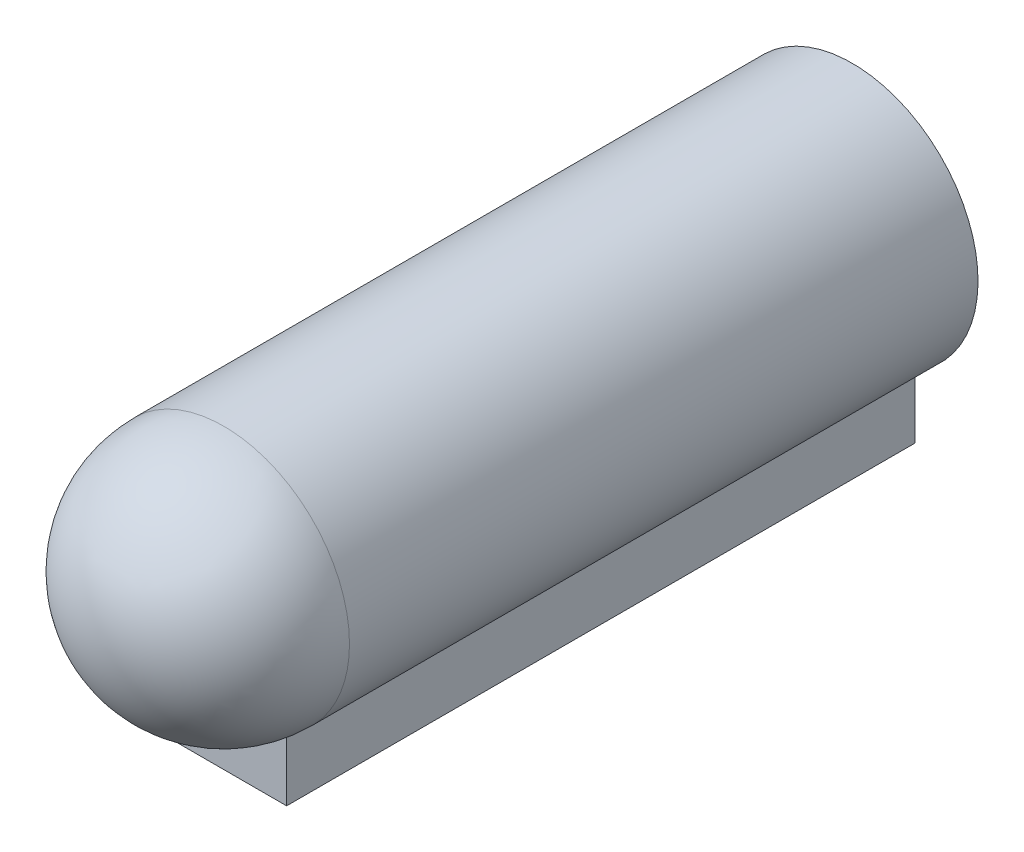
ISO-10303-21;
HEADER;
FILE_DESCRIPTION(('STEP AP214'),'2;1');
FILE_NAME('part.step','',(''),(''),'','','');
FILE_SCHEMA(('AUTOMOTIVE_DESIGN { 1 0 10303 214 1 1 1 1 }'));
ENDSEC;
DATA;
#1=APPLICATION_CONTEXT('core data for automotive mechanical design processes');
#2=APPLICATION_PROTOCOL_DEFINITION('international standard','automotive_design',2000,#1);
#3=PRODUCT_CONTEXT('',#1,'mechanical');
#4=PRODUCT('Part','Part','',(#3));
#5=PRODUCT_RELATED_PRODUCT_CATEGORY('part','',(#4));
#6=PRODUCT_DEFINITION_FORMATION('','',#4);
#7=PRODUCT_DEFINITION_CONTEXT('part definition',#1,'design');
#8=PRODUCT_DEFINITION('design','',#6,#7);
#9=PRODUCT_DEFINITION_SHAPE('','',#8);
#10=(LENGTH_UNIT() NAMED_UNIT(*) SI_UNIT(.MILLI.,.METRE.));
#11=(NAMED_UNIT(*) PLANE_ANGLE_UNIT() SI_UNIT($,.RADIAN.));
#12=(NAMED_UNIT(*) SI_UNIT($,.STERADIAN.) SOLID_ANGLE_UNIT());
#13=UNCERTAINTY_MEASURE_WITH_UNIT(LENGTH_MEASURE(1.E-05),#10,'distance_accuracy_value','');
#14=(GEOMETRIC_REPRESENTATION_CONTEXT(3) GLOBAL_UNCERTAINTY_ASSIGNED_CONTEXT((#13)) GLOBAL_UNIT_ASSIGNED_CONTEXT((#10,
#11,#12)) REPRESENTATION_CONTEXT('',''));
#15=CARTESIAN_POINT('',(0.,0.,0.));
#16=DIRECTION('',(0.,0.,1.));
#17=DIRECTION('',(1.,0.,0.));
#18=AXIS2_PLACEMENT_3D('',#15,#16,#17);
#19=CARTESIAN_POINT('',(0.,0.,30.));
#20=DIRECTION('',(0.,0.,-1.));
#21=DIRECTION('',(-1.,0.,0.));
#22=AXIS2_PLACEMENT_3D('',#19,#20,#21);
#23=CYLINDRICAL_SURFACE('',#22,5.);
#24=CARTESIAN_POINT('',(0.,0.,25.));
#25=DIRECTION('',(0.,0.,-1.));
#26=DIRECTION('',(-1.,0.,0.));
#27=AXIS2_PLACEMENT_3D('',#24,#25,#26);
#28=CIRCLE('',#27,5.);
#29=CARTESIAN_POINT('',(-2.5,-4.33012701892219,25.));
#30=VERTEX_POINT('',#29);
#31=CARTESIAN_POINT('',(2.5,-4.33012701892219,25.));
#32=VERTEX_POINT('',#31);
#33=EDGE_CURVE('E48',#30,#32,#28,.T.);
#34=ORIENTED_EDGE('',*,*,#33,.T.);
#35=DIRECTION('',(0.,0.,-1.));
#36=VECTOR('',#35,1.);
#37=CARTESIAN_POINT('',(2.5,-4.33012701892219,25.));
#38=LINE('',#37,#36);
#39=CARTESIAN_POINT('',(2.5,-4.33012701892219,0.));
#40=VERTEX_POINT('',#39);
#41=EDGE_CURVE('E55',#32,#40,#38,.T.);
#42=ORIENTED_EDGE('',*,*,#41,.T.);
#43=CARTESIAN_POINT('',(0.,0.,0.));
#44=DIRECTION('',(0.,0.,1.));
#45=DIRECTION('',(1.,0.,0.));
#46=AXIS2_PLACEMENT_3D('',#43,#44,#45);
#47=CIRCLE('',#46,5.);
#48=CARTESIAN_POINT('',(-2.5,-4.33012701892219,0.));
#49=VERTEX_POINT('',#48);
#50=EDGE_CURVE('E59',#40,#49,#47,.T.);
#51=ORIENTED_EDGE('',*,*,#50,.T.);
#52=DIRECTION('',(0.,0.,-1.));
#53=VECTOR('',#52,1.);
#54=CARTESIAN_POINT('',(-2.5,-4.33012701892219,25.));
#55=LINE('',#54,#53);
#56=EDGE_CURVE('E91',#30,#49,#55,.T.);
#57=ORIENTED_EDGE('',*,*,#56,.F.);
#58=EDGE_LOOP('',(#34,#42,#51,#57));
#59=FACE_BOUND('',#58,.T.);
#60=ADVANCED_FACE('F39',(#59),#23,.T.);
#61=CARTESIAN_POINT('',(0.,0.,0.));
#62=DIRECTION('',(0.,0.,1.));
#63=DIRECTION('',(1.,0.,0.));
#64=AXIS2_PLACEMENT_3D('',#61,#62,#63);
#65=PLANE('',#64);
#66=CARTESIAN_POINT('',(0.,0.,0.));
#67=DIRECTION('',(0.,0.,1.));
#68=DIRECTION('',(1.,0.,0.));
#69=AXIS2_PLACEMENT_3D('',#66,#67,#68);
#70=CIRCLE('',#69,3.);
#71=CARTESIAN_POINT('',(3.,0.,0.));
#72=VERTEX_POINT('',#71);
#73=EDGE_CURVE('E121',#72,#72,#70,.T.);
#74=ORIENTED_EDGE('',*,*,#73,.T.);
#75=EDGE_LOOP('',(#74));
#76=FACE_BOUND('',#75,.T.);
#77=ORIENTED_EDGE('',*,*,#50,.F.);
#78=DIRECTION('',(0.,-1.,0.));
#79=VECTOR('',#78,1.);
#80=CARTESIAN_POINT('',(2.5,0.,0.));
#81=LINE('',#80,#79);
#82=CARTESIAN_POINT('',(2.5,-6.83012701892219,0.));
#83=VERTEX_POINT('',#82);
#84=EDGE_CURVE('E106',#40,#83,#81,.T.);
#85=ORIENTED_EDGE('',*,*,#84,.T.);
#86=DIRECTION('',(-1.,0.,0.));
#87=VECTOR('',#86,1.);
#88=CARTESIAN_POINT('',(0.,-6.83012701892219,0.));
#89=LINE('',#88,#87);
#90=CARTESIAN_POINT('',(-2.5,-6.83012701892219,0.));
#91=VERTEX_POINT('',#90);
#92=EDGE_CURVE('E114',#83,#91,#89,.T.);
#93=ORIENTED_EDGE('',*,*,#92,.T.);
#94=DIRECTION('',(0.,1.,0.));
#95=VECTOR('',#94,1.);
#96=CARTESIAN_POINT('',(-2.5,0.,0.));
#97=LINE('',#96,#95);
#98=EDGE_CURVE('E85',#91,#49,#97,.T.);
#99=ORIENTED_EDGE('',*,*,#98,.T.);
#100=EDGE_LOOP('',(#77,#85,#93,#99));
#101=FACE_BOUND('',#100,.T.);
#102=ADVANCED_FACE('F139',(#76,#101),#65,.F.);
#103=CARTESIAN_POINT('',(0.,0.,20.));
#104=DIRECTION('',(0.,0.,-1.));
#105=DIRECTION('',(-1.,0.,0.));
#106=AXIS2_PLACEMENT_3D('',#103,#104,#105);
#107=CYLINDRICAL_SURFACE('',#106,3.);
#108=CARTESIAN_POINT('',(0.,0.,20.));
#109=DIRECTION('',(0.,0.,1.));
#110=DIRECTION('',(1.,0.,0.));
#111=AXIS2_PLACEMENT_3D('',#108,#109,#110);
#112=CIRCLE('',#111,3.);
#113=CARTESIAN_POINT('',(3.,0.,20.));
#114=VERTEX_POINT('',#113);
#115=EDGE_CURVE('E126',#114,#114,#112,.T.);
#116=ORIENTED_EDGE('',*,*,#115,.T.);
#117=EDGE_LOOP('',(#116));
#118=FACE_BOUND('',#117,.T.);
#119=ORIENTED_EDGE('',*,*,#73,.F.);
#120=EDGE_LOOP('',(#119));
#121=FACE_BOUND('',#120,.T.);
#122=ADVANCED_FACE('F141',(#118,#121),#107,.F.);
#123=CARTESIAN_POINT('',(0.,0.,20.));
#124=DIRECTION('',(0.,0.,1.));
#125=DIRECTION('',(1.,0.,0.));
#126=AXIS2_PLACEMENT_3D('',#123,#124,#125);
#127=PLANE('',#126);
#128=ORIENTED_EDGE('',*,*,#115,.F.);
#129=EDGE_LOOP('',(#128));
#130=FACE_BOUND('',#129,.T.);
#131=ADVANCED_FACE('F148',(#130),#127,.F.);
#132=CARTESIAN_POINT('',(0.,0.,25.));
#133=DIRECTION('',(0.,0.,1.));
#134=DIRECTION('',(1.,0.,0.));
#135=AXIS2_PLACEMENT_3D('',#132,#133,#134);
#136=SPHERICAL_SURFACE('',#135,5.);
#137=EDGE_CURVE('E11',#32,#30,#28,.T.);
#138=ORIENTED_EDGE('',*,*,#137,.F.);
#139=ORIENTED_EDGE('',*,*,#33,.F.);
#140=EDGE_LOOP('',(#138,#139));
#141=FACE_BOUND('',#140,.T.);
#142=ADVANCED_FACE('F41',(#141),#136,.T.);
#143=CARTESIAN_POINT('',(0.,-6.83012701892219,25.));
#144=DIRECTION('',(0.,-1.,0.));
#145=DIRECTION('',(1.,0.,0.));
#146=AXIS2_PLACEMENT_3D('',#143,#144,#145);
#147=PLANE('',#146);
#148=ORIENTED_EDGE('',*,*,#92,.F.);
#149=DIRECTION('',(0.,0.,-1.));
#150=VECTOR('',#149,1.);
#151=CARTESIAN_POINT('',(2.5,-6.83012701892219,25.));
#152=LINE('',#151,#150);
#153=CARTESIAN_POINT('',(2.5,-6.83012701892219,25.));
#154=VERTEX_POINT('',#153);
#155=EDGE_CURVE('E104',#154,#83,#152,.T.);
#156=ORIENTED_EDGE('',*,*,#155,.F.);
#157=DIRECTION('',(-1.,0.,0.));
#158=VECTOR('',#157,1.);
#159=CARTESIAN_POINT('',(0.,-6.83012701892219,25.));
#160=LINE('',#159,#158);
#161=CARTESIAN_POINT('',(-2.5,-6.83012701892219,25.));
#162=VERTEX_POINT('',#161);
#163=EDGE_CURVE('E98',#154,#162,#160,.T.);
#164=ORIENTED_EDGE('',*,*,#163,.T.);
#165=DIRECTION('',(0.,0.,-1.));
#166=VECTOR('',#165,1.);
#167=CARTESIAN_POINT('',(-2.5,-6.83012701892219,25.));
#168=LINE('',#167,#166);
#169=EDGE_CURVE('E80',#162,#91,#168,.T.);
#170=ORIENTED_EDGE('',*,*,#169,.T.);
#171=EDGE_LOOP('',(#148,#156,#164,#170));
#172=FACE_BOUND('',#171,.T.);
#173=ADVANCED_FACE('F103',(#172),#147,.T.);
#174=CARTESIAN_POINT('',(2.5,0.,25.));
#175=DIRECTION('',(1.,0.,0.));
#176=DIRECTION('',(0.,1.,0.));
#177=AXIS2_PLACEMENT_3D('',#174,#175,#176);
#178=PLANE('',#177);
#179=ORIENTED_EDGE('',*,*,#84,.F.);
#180=ORIENTED_EDGE('',*,*,#41,.F.);
#181=DIRECTION('',(0.,-1.,0.));
#182=VECTOR('',#181,1.);
#183=CARTESIAN_POINT('',(2.5,0.,25.));
#184=LINE('',#183,#182);
#185=EDGE_CURVE('E92',#32,#154,#184,.T.);
#186=ORIENTED_EDGE('',*,*,#185,.T.);
#187=ORIENTED_EDGE('',*,*,#155,.T.);
#188=EDGE_LOOP('',(#179,#180,#186,#187));
#189=FACE_BOUND('',#188,.T.);
#190=ADVANCED_FACE('F137',(#189),#178,.T.);
#191=CARTESIAN_POINT('',(-2.5,0.,25.));
#192=DIRECTION('',(-1.,0.,0.));
#193=DIRECTION('',(0.,0.,1.));
#194=AXIS2_PLACEMENT_3D('',#191,#192,#193);
#195=PLANE('',#194);
#196=ORIENTED_EDGE('',*,*,#98,.F.);
#197=ORIENTED_EDGE('',*,*,#169,.F.);
#198=DIRECTION('',(0.,1.,0.));
#199=VECTOR('',#198,1.);
#200=CARTESIAN_POINT('',(-2.5,0.,25.));
#201=LINE('',#200,#199);
#202=EDGE_CURVE('E83',#162,#30,#201,.T.);
#203=ORIENTED_EDGE('',*,*,#202,.T.);
#204=ORIENTED_EDGE('',*,*,#56,.T.);
#205=EDGE_LOOP('',(#196,#197,#203,#204));
#206=FACE_BOUND('',#205,.T.);
#207=ADVANCED_FACE('F82',(#206),#195,.T.);
#208=CARTESIAN_POINT('',(0.,0.,25.));
#209=DIRECTION('',(0.,0.,-1.));
#210=DIRECTION('',(-1.,0.,0.));
#211=AXIS2_PLACEMENT_3D('',#208,#209,#210);
#212=PLANE('',#211);
#213=ORIENTED_EDGE('',*,*,#163,.F.);
#214=ORIENTED_EDGE('',*,*,#185,.F.);
#215=ORIENTED_EDGE('',*,*,#137,.T.);
#216=ORIENTED_EDGE('',*,*,#202,.F.);
#217=EDGE_LOOP('',(#213,#214,#215,#216));
#218=FACE_BOUND('',#217,.T.);
#219=ADVANCED_FACE('F96',(#218),#212,.F.);
#220=CLOSED_SHELL('',(#60,#102,#122,#131,#142,#173,#190,#207,#219));
#221=MANIFOLD_SOLID_BREP('B2',#220);
#222=ADVANCED_BREP_SHAPE_REPRESENTATION('',(#18,#221),#14);
#223=SHAPE_DEFINITION_REPRESENTATION(#9,#222);
ENDSEC;
END-ISO-10303-21;
